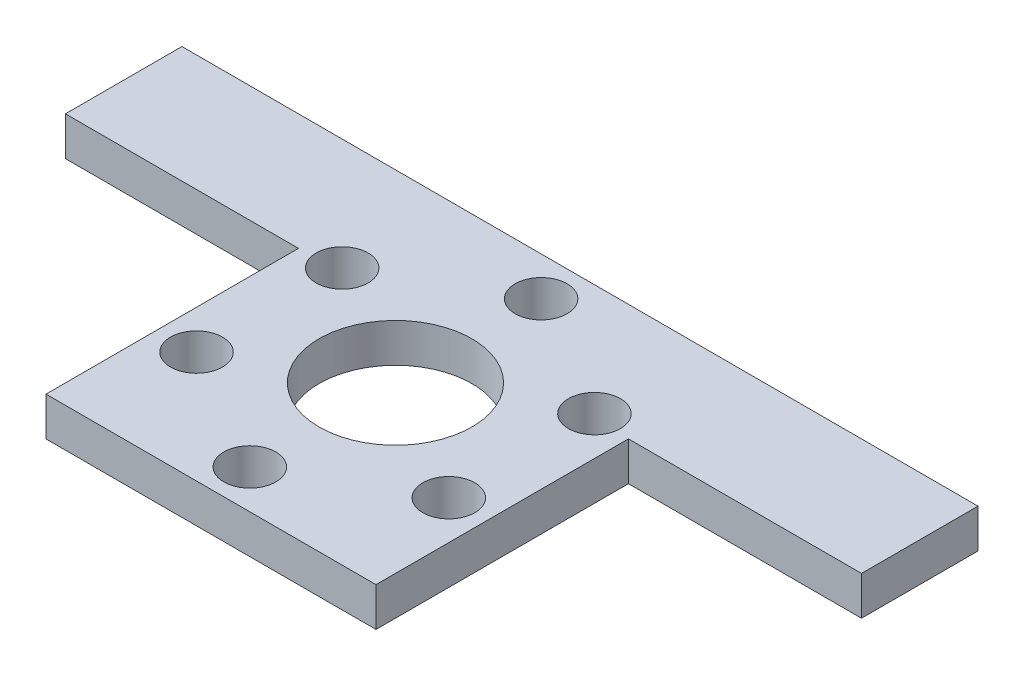
ISO-10303-21;
HEADER;
FILE_DESCRIPTION(('STEP AP214'),'2;1');
FILE_NAME('part.step','',(''),(''),'','','');
FILE_SCHEMA(('AUTOMOTIVE_DESIGN { 1 0 10303 214 1 1 1 1 }'));
ENDSEC;
DATA;
#1=APPLICATION_CONTEXT('core data for automotive mechanical design processes');
#2=APPLICATION_PROTOCOL_DEFINITION('international standard','automotive_design',2000,#1);
#3=PRODUCT_CONTEXT('',#1,'mechanical');
#4=PRODUCT('Part','Part','',(#3));
#5=PRODUCT_RELATED_PRODUCT_CATEGORY('part','',(#4));
#6=PRODUCT_DEFINITION_FORMATION('','',#4);
#7=PRODUCT_DEFINITION_CONTEXT('part definition',#1,'design');
#8=PRODUCT_DEFINITION('design','',#6,#7);
#9=PRODUCT_DEFINITION_SHAPE('','',#8);
#10=(LENGTH_UNIT() NAMED_UNIT(*) SI_UNIT(.MILLI.,.METRE.));
#11=(NAMED_UNIT(*) PLANE_ANGLE_UNIT() SI_UNIT($,.RADIAN.));
#12=(NAMED_UNIT(*) SI_UNIT($,.STERADIAN.) SOLID_ANGLE_UNIT());
#13=UNCERTAINTY_MEASURE_WITH_UNIT(LENGTH_MEASURE(1.E-05),#10,'distance_accuracy_value','');
#14=(GEOMETRIC_REPRESENTATION_CONTEXT(3) GLOBAL_UNCERTAINTY_ASSIGNED_CONTEXT((#13)) GLOBAL_UNIT_ASSIGNED_CONTEXT((#10,
#11,#12)) REPRESENTATION_CONTEXT('',''));
#15=CARTESIAN_POINT('',(0.,0.,0.));
#16=DIRECTION('',(0.,0.,1.));
#17=DIRECTION('',(1.,0.,0.));
#18=AXIS2_PLACEMENT_3D('',#15,#16,#17);
#19=CARTESIAN_POINT('',(0.,2.54,0.));
#20=DIRECTION('',(0.,-1.,0.));
#21=DIRECTION('',(0.,0.,-1.));
#22=AXIS2_PLACEMENT_3D('',#19,#20,#21);
#23=PLANE('',#22);
#24=CARTESIAN_POINT('',(0.,2.54,-9.525));
#25=DIRECTION('',(0.,1.,0.));
#26=DIRECTION('',(0.,0.,1.));
#27=AXIS2_PLACEMENT_3D('',#24,#25,#26);
#28=CIRCLE('',#27,1.7);
#29=CARTESIAN_POINT('',(0.,2.54,-7.825));
#30=VERTEX_POINT('',#29);
#31=EDGE_CURVE('E260',#30,#30,#28,.T.);
#32=ORIENTED_EDGE('',*,*,#31,.F.);
#33=EDGE_LOOP('',(#32));
#34=FACE_BOUND('',#33,.T.);
#35=CARTESIAN_POINT('',(8.24889197104678,2.54,-4.7625));
#36=DIRECTION('',(0.,1.,0.));
#37=DIRECTION('',(0.,0.,1.));
#38=AXIS2_PLACEMENT_3D('',#35,#36,#37);
#39=CIRCLE('',#38,1.7);
#40=CARTESIAN_POINT('',(8.24889197104678,2.54,-3.0625));
#41=VERTEX_POINT('',#40);
#42=EDGE_CURVE('E252',#41,#41,#39,.T.);
#43=ORIENTED_EDGE('',*,*,#42,.F.);
#44=EDGE_LOOP('',(#43));
#45=FACE_BOUND('',#44,.T.);
#46=CARTESIAN_POINT('',(8.24889197104678,2.54,4.7625));
#47=DIRECTION('',(0.,1.,0.));
#48=DIRECTION('',(0.,0.,1.));
#49=AXIS2_PLACEMENT_3D('',#46,#47,#48);
#50=CIRCLE('',#49,1.7);
#51=CARTESIAN_POINT('',(8.24889197104678,2.54,6.4625));
#52=VERTEX_POINT('',#51);
#53=EDGE_CURVE('E244',#52,#52,#50,.T.);
#54=ORIENTED_EDGE('',*,*,#53,.F.);
#55=EDGE_LOOP('',(#54));
#56=FACE_BOUND('',#55,.T.);
#57=CARTESIAN_POINT('',(0.,2.54,9.525));
#58=DIRECTION('',(0.,1.,0.));
#59=DIRECTION('',(0.,0.,1.));
#60=AXIS2_PLACEMENT_3D('',#57,#58,#59);
#61=CIRCLE('',#60,1.7);
#62=CARTESIAN_POINT('',(0.,2.54,11.225));
#63=VERTEX_POINT('',#62);
#64=EDGE_CURVE('E236',#63,#63,#61,.T.);
#65=ORIENTED_EDGE('',*,*,#64,.F.);
#66=EDGE_LOOP('',(#65));
#67=FACE_BOUND('',#66,.T.);
#68=CARTESIAN_POINT('',(-8.24889197104678,2.54,4.7625));
#69=DIRECTION('',(0.,1.,0.));
#70=DIRECTION('',(0.,0.,1.));
#71=AXIS2_PLACEMENT_3D('',#68,#69,#70);
#72=CIRCLE('',#71,1.7);
#73=CARTESIAN_POINT('',(-8.24889197104678,2.54,6.4625));
#74=VERTEX_POINT('',#73);
#75=EDGE_CURVE('E228',#74,#74,#72,.T.);
#76=ORIENTED_EDGE('',*,*,#75,.F.);
#77=EDGE_LOOP('',(#76));
#78=FACE_BOUND('',#77,.T.);
#79=CARTESIAN_POINT('',(-8.24889197104678,2.54,-4.7625));
#80=DIRECTION('',(0.,1.,0.));
#81=DIRECTION('',(0.,0.,1.));
#82=AXIS2_PLACEMENT_3D('',#79,#80,#81);
#83=CIRCLE('',#82,1.7);
#84=CARTESIAN_POINT('',(-8.24889197104678,2.54,-3.0625));
#85=VERTEX_POINT('',#84);
#86=EDGE_CURVE('E220',#85,#85,#83,.T.);
#87=ORIENTED_EDGE('',*,*,#86,.F.);
#88=EDGE_LOOP('',(#87));
#89=FACE_BOUND('',#88,.T.);
#90=DIRECTION('',(1.,0.,0.));
#91=VECTOR('',#90,1.);
#92=CARTESIAN_POINT('',(-26.0288919710468,2.54,-4.445));
#93=LINE('',#92,#91);
#94=CARTESIAN_POINT('',(-26.0288919710468,2.54,-4.445));
#95=VERTEX_POINT('',#94);
#96=CARTESIAN_POINT('',(-10.7888919710468,2.54,-4.445));
#97=VERTEX_POINT('',#96);
#98=EDGE_CURVE('E164',#95,#97,#93,.T.);
#99=ORIENTED_EDGE('',*,*,#98,.T.);
#100=DIRECTION('',(0.,0.,1.));
#101=VECTOR('',#100,1.);
#102=CARTESIAN_POINT('',(-10.7888919710468,2.54,-4.445));
#103=LINE('',#102,#101);
#104=CARTESIAN_POINT('',(-10.7888919710468,2.54,12.065));
#105=VERTEX_POINT('',#104);
#106=EDGE_CURVE('E100',#97,#105,#103,.T.);
#107=ORIENTED_EDGE('',*,*,#106,.T.);
#108=DIRECTION('',(1.,0.,0.));
#109=VECTOR('',#108,1.);
#110=CARTESIAN_POINT('',(-10.7888919710468,2.54,12.065));
#111=LINE('',#110,#109);
#112=CARTESIAN_POINT('',(10.7888919710468,2.54,12.065));
#113=VERTEX_POINT('',#112);
#114=EDGE_CURVE('E185',#105,#113,#111,.T.);
#115=ORIENTED_EDGE('',*,*,#114,.T.);
#116=DIRECTION('',(0.,0.,-1.));
#117=VECTOR('',#116,1.);
#118=CARTESIAN_POINT('',(10.7888919710468,2.54,-4.445));
#119=LINE('',#118,#117);
#120=CARTESIAN_POINT('',(10.7888919710468,2.54,-4.445));
#121=VERTEX_POINT('',#120);
#122=EDGE_CURVE('E199',#113,#121,#119,.T.);
#123=ORIENTED_EDGE('',*,*,#122,.T.);
#124=DIRECTION('',(1.,0.,0.));
#125=VECTOR('',#124,1.);
#126=CARTESIAN_POINT('',(10.7888919710468,2.54,-4.445));
#127=LINE('',#126,#125);
#128=CARTESIAN_POINT('',(26.0288919710468,2.54,-4.445));
#129=VERTEX_POINT('',#128);
#130=EDGE_CURVE('E119',#121,#129,#127,.T.);
#131=ORIENTED_EDGE('',*,*,#130,.T.);
#132=DIRECTION('',(0.,0.,-1.));
#133=VECTOR('',#132,1.);
#134=CARTESIAN_POINT('',(26.0288919710468,2.54,-12.065));
#135=LINE('',#134,#133);
#136=CARTESIAN_POINT('',(26.0288919710468,2.54,-12.065));
#137=VERTEX_POINT('',#136);
#138=EDGE_CURVE('E113',#129,#137,#135,.T.);
#139=ORIENTED_EDGE('',*,*,#138,.T.);
#140=DIRECTION('',(-1.,0.,0.));
#141=VECTOR('',#140,1.);
#142=CARTESIAN_POINT('',(-26.0288919710468,2.54,-12.065));
#143=LINE('',#142,#141);
#144=CARTESIAN_POINT('',(-26.0288919710468,2.54,-12.065));
#145=VERTEX_POINT('',#144);
#146=EDGE_CURVE('E117',#137,#145,#143,.T.);
#147=ORIENTED_EDGE('',*,*,#146,.T.);
#148=DIRECTION('',(0.,0.,1.));
#149=VECTOR('',#148,1.);
#150=CARTESIAN_POINT('',(-26.0288919710468,2.54,-12.065));
#151=LINE('',#150,#149);
#152=EDGE_CURVE('E57',#145,#95,#151,.T.);
#153=ORIENTED_EDGE('',*,*,#152,.T.);
#154=EDGE_LOOP('',(#99,#107,#115,#123,#131,#139,#147,#153));
#155=FACE_BOUND('',#154,.T.);
#156=CARTESIAN_POINT('',(0.,2.54,0.));
#157=DIRECTION('',(0.,1.,0.));
#158=DIRECTION('',(0.,0.,1.));
#159=AXIS2_PLACEMENT_3D('',#156,#157,#158);
#160=CIRCLE('',#159,5.);
#161=CARTESIAN_POINT('',(0.,2.54,5.));
#162=VERTEX_POINT('',#161);
#163=EDGE_CURVE('E146',#162,#162,#160,.T.);
#164=ORIENTED_EDGE('',*,*,#163,.F.);
#165=EDGE_LOOP('',(#164));
#166=FACE_BOUND('',#165,.T.);
#167=ADVANCED_FACE('F39',(#34,#45,#56,#67,#78,#89,#155,#166),#23,.F.);
#168=CARTESIAN_POINT('',(0.,0.,0.));
#169=DIRECTION('',(0.,-1.,0.));
#170=DIRECTION('',(0.,0.,-1.));
#171=AXIS2_PLACEMENT_3D('',#168,#169,#170);
#172=PLANE('',#171);
#173=CARTESIAN_POINT('',(0.,0.,-9.525));
#174=DIRECTION('',(0.,1.,0.));
#175=DIRECTION('',(0.,0.,1.));
#176=AXIS2_PLACEMENT_3D('',#173,#174,#175);
#177=CIRCLE('',#176,1.7);
#178=CARTESIAN_POINT('',(0.,0.,-7.825));
#179=VERTEX_POINT('',#178);
#180=EDGE_CURVE('E256',#179,#179,#177,.T.);
#181=ORIENTED_EDGE('',*,*,#180,.T.);
#182=EDGE_LOOP('',(#181));
#183=FACE_BOUND('',#182,.T.);
#184=CARTESIAN_POINT('',(8.24889197104678,0.,-4.7625));
#185=DIRECTION('',(0.,1.,0.));
#186=DIRECTION('',(0.,0.,1.));
#187=AXIS2_PLACEMENT_3D('',#184,#185,#186);
#188=CIRCLE('',#187,1.7);
#189=CARTESIAN_POINT('',(8.24889197104678,0.,-3.06250000000001));
#190=VERTEX_POINT('',#189);
#191=EDGE_CURVE('E248',#190,#190,#188,.T.);
#192=ORIENTED_EDGE('',*,*,#191,.T.);
#193=EDGE_LOOP('',(#192));
#194=FACE_BOUND('',#193,.T.);
#195=CARTESIAN_POINT('',(8.24889197104678,0.,4.7625));
#196=DIRECTION('',(0.,1.,0.));
#197=DIRECTION('',(0.,0.,1.));
#198=AXIS2_PLACEMENT_3D('',#195,#196,#197);
#199=CIRCLE('',#198,1.7);
#200=CARTESIAN_POINT('',(8.24889197104678,0.,6.4625));
#201=VERTEX_POINT('',#200);
#202=EDGE_CURVE('E240',#201,#201,#199,.T.);
#203=ORIENTED_EDGE('',*,*,#202,.T.);
#204=EDGE_LOOP('',(#203));
#205=FACE_BOUND('',#204,.T.);
#206=CARTESIAN_POINT('',(0.,0.,9.525));
#207=DIRECTION('',(0.,1.,0.));
#208=DIRECTION('',(0.,0.,1.));
#209=AXIS2_PLACEMENT_3D('',#206,#207,#208);
#210=CIRCLE('',#209,1.7);
#211=CARTESIAN_POINT('',(0.,0.,11.225));
#212=VERTEX_POINT('',#211);
#213=EDGE_CURVE('E232',#212,#212,#210,.T.);
#214=ORIENTED_EDGE('',*,*,#213,.T.);
#215=EDGE_LOOP('',(#214));
#216=FACE_BOUND('',#215,.T.);
#217=CARTESIAN_POINT('',(-8.24889197104678,0.,4.7625));
#218=DIRECTION('',(0.,1.,0.));
#219=DIRECTION('',(0.,0.,1.));
#220=AXIS2_PLACEMENT_3D('',#217,#218,#219);
#221=CIRCLE('',#220,1.7);
#222=CARTESIAN_POINT('',(-8.24889197104678,0.,6.4625));
#223=VERTEX_POINT('',#222);
#224=EDGE_CURVE('E224',#223,#223,#221,.T.);
#225=ORIENTED_EDGE('',*,*,#224,.T.);
#226=EDGE_LOOP('',(#225));
#227=FACE_BOUND('',#226,.T.);
#228=CARTESIAN_POINT('',(-8.24889197104678,0.,-4.7625));
#229=DIRECTION('',(0.,1.,0.));
#230=DIRECTION('',(0.,0.,1.));
#231=AXIS2_PLACEMENT_3D('',#228,#229,#230);
#232=CIRCLE('',#231,1.7);
#233=CARTESIAN_POINT('',(-8.24889197104678,0.,-3.0625));
#234=VERTEX_POINT('',#233);
#235=EDGE_CURVE('E213',#234,#234,#232,.T.);
#236=ORIENTED_EDGE('',*,*,#235,.T.);
#237=EDGE_LOOP('',(#236));
#238=FACE_BOUND('',#237,.T.);
#239=DIRECTION('',(1.,0.,0.));
#240=VECTOR('',#239,1.);
#241=CARTESIAN_POINT('',(-26.0288919710468,0.,-4.445));
#242=LINE('',#241,#240);
#243=CARTESIAN_POINT('',(-26.0288919710468,0.,-4.445));
#244=VERTEX_POINT('',#243);
#245=CARTESIAN_POINT('',(-10.7888919710468,0.,-4.445));
#246=VERTEX_POINT('',#245);
#247=EDGE_CURVE('E141',#244,#246,#242,.T.);
#248=ORIENTED_EDGE('',*,*,#247,.F.);
#249=DIRECTION('',(0.,0.,1.));
#250=VECTOR('',#249,1.);
#251=CARTESIAN_POINT('',(-26.0288919710468,0.,-12.065));
#252=LINE('',#251,#250);
#253=CARTESIAN_POINT('',(-26.0288919710468,0.,-12.065));
#254=VERTEX_POINT('',#253);
#255=EDGE_CURVE('E92',#254,#244,#252,.T.);
#256=ORIENTED_EDGE('',*,*,#255,.F.);
#257=DIRECTION('',(-1.,0.,0.));
#258=VECTOR('',#257,1.);
#259=CARTESIAN_POINT('',(-26.0288919710468,0.,-12.065));
#260=LINE('',#259,#258);
#261=CARTESIAN_POINT('',(26.0288919710468,0.,-12.065));
#262=VERTEX_POINT('',#261);
#263=EDGE_CURVE('E86',#262,#254,#260,.T.);
#264=ORIENTED_EDGE('',*,*,#263,.F.);
#265=DIRECTION('',(0.,0.,-1.));
#266=VECTOR('',#265,1.);
#267=CARTESIAN_POINT('',(26.0288919710468,0.,-12.065));
#268=LINE('',#267,#266);
#269=CARTESIAN_POINT('',(26.0288919710468,0.,-4.445));
#270=VERTEX_POINT('',#269);
#271=EDGE_CURVE('E128',#270,#262,#268,.T.);
#272=ORIENTED_EDGE('',*,*,#271,.F.);
#273=DIRECTION('',(1.,0.,0.));
#274=VECTOR('',#273,1.);
#275=CARTESIAN_POINT('',(10.7888919710468,0.,-4.445));
#276=LINE('',#275,#274);
#277=CARTESIAN_POINT('',(10.7888919710468,0.,-4.445));
#278=VERTEX_POINT('',#277);
#279=EDGE_CURVE('E155',#278,#270,#276,.T.);
#280=ORIENTED_EDGE('',*,*,#279,.F.);
#281=DIRECTION('',(0.,0.,-1.));
#282=VECTOR('',#281,1.);
#283=CARTESIAN_POINT('',(10.7888919710468,0.,-4.445));
#284=LINE('',#283,#282);
#285=CARTESIAN_POINT('',(10.7888919710468,0.,12.065));
#286=VERTEX_POINT('',#285);
#287=EDGE_CURVE('E152',#286,#278,#284,.T.);
#288=ORIENTED_EDGE('',*,*,#287,.F.);
#289=DIRECTION('',(1.,0.,0.));
#290=VECTOR('',#289,1.);
#291=CARTESIAN_POINT('',(-10.7888919710468,0.,12.065));
#292=LINE('',#291,#290);
#293=CARTESIAN_POINT('',(-10.7888919710468,0.,12.065));
#294=VERTEX_POINT('',#293);
#295=EDGE_CURVE('E149',#294,#286,#292,.T.);
#296=ORIENTED_EDGE('',*,*,#295,.F.);
#297=DIRECTION('',(0.,0.,1.));
#298=VECTOR('',#297,1.);
#299=CARTESIAN_POINT('',(-10.7888919710468,0.,-4.445));
#300=LINE('',#299,#298);
#301=EDGE_CURVE('E145',#246,#294,#300,.T.);
#302=ORIENTED_EDGE('',*,*,#301,.F.);
#303=EDGE_LOOP('',(#248,#256,#264,#272,#280,#288,#296,#302));
#304=FACE_BOUND('',#303,.T.);
#305=CARTESIAN_POINT('',(0.,0.,0.));
#306=DIRECTION('',(0.,1.,0.));
#307=DIRECTION('',(0.,0.,1.));
#308=AXIS2_PLACEMENT_3D('',#305,#306,#307);
#309=CIRCLE('',#308,5.);
#310=CARTESIAN_POINT('',(0.,0.,5.));
#311=VERTEX_POINT('',#310);
#312=EDGE_CURVE('E209',#311,#311,#309,.T.);
#313=ORIENTED_EDGE('',*,*,#312,.T.);
#314=EDGE_LOOP('',(#313));
#315=FACE_BOUND('',#314,.T.);
#316=ADVANCED_FACE('F189',(#183,#194,#205,#216,#227,#238,#304,#315),#172,.T.);
#317=CARTESIAN_POINT('',(-26.0288919710468,2.54,-4.445));
#318=DIRECTION('',(0.,0.,-1.));
#319=DIRECTION('',(-1.,0.,0.));
#320=AXIS2_PLACEMENT_3D('',#317,#318,#319);
#321=PLANE('',#320);
#322=ORIENTED_EDGE('',*,*,#247,.T.);
#323=DIRECTION('',(0.,-1.,0.));
#324=VECTOR('',#323,1.);
#325=CARTESIAN_POINT('',(-10.7888919710468,2.54,-4.445));
#326=LINE('',#325,#324);
#327=EDGE_CURVE('E11',#97,#246,#326,.T.);
#328=ORIENTED_EDGE('',*,*,#327,.F.);
#329=ORIENTED_EDGE('',*,*,#98,.F.);
#330=DIRECTION('',(0.,-1.,0.));
#331=VECTOR('',#330,1.);
#332=CARTESIAN_POINT('',(-26.0288919710468,2.54,-4.445));
#333=LINE('',#332,#331);
#334=EDGE_CURVE('E137',#95,#244,#333,.T.);
#335=ORIENTED_EDGE('',*,*,#334,.T.);
#336=EDGE_LOOP('',(#322,#328,#329,#335));
#337=FACE_BOUND('',#336,.T.);
#338=ADVANCED_FACE('F41',(#337),#321,.F.);
#339=CARTESIAN_POINT('',(-10.7888919710468,2.54,-4.445));
#340=DIRECTION('',(1.,0.,0.));
#341=DIRECTION('',(0.,0.,-1.));
#342=AXIS2_PLACEMENT_3D('',#339,#340,#341);
#343=PLANE('',#342);
#344=ORIENTED_EDGE('',*,*,#301,.T.);
#345=DIRECTION('',(0.,-1.,0.));
#346=VECTOR('',#345,1.);
#347=CARTESIAN_POINT('',(-10.7888919710468,2.54,12.065));
#348=LINE('',#347,#346);
#349=EDGE_CURVE('E49',#105,#294,#348,.T.);
#350=ORIENTED_EDGE('',*,*,#349,.F.);
#351=ORIENTED_EDGE('',*,*,#106,.F.);
#352=ORIENTED_EDGE('',*,*,#327,.T.);
#353=EDGE_LOOP('',(#344,#350,#351,#352));
#354=FACE_BOUND('',#353,.T.);
#355=ADVANCED_FACE('F313',(#354),#343,.F.);
#356=CARTESIAN_POINT('',(-10.7888919710468,2.54,12.065));
#357=DIRECTION('',(0.,0.,-1.));
#358=DIRECTION('',(-1.,0.,0.));
#359=AXIS2_PLACEMENT_3D('',#356,#357,#358);
#360=PLANE('',#359);
#361=ORIENTED_EDGE('',*,*,#295,.T.);
#362=DIRECTION('',(0.,-1.,0.));
#363=VECTOR('',#362,1.);
#364=CARTESIAN_POINT('',(10.7888919710468,2.54,12.065));
#365=LINE('',#364,#363);
#366=EDGE_CURVE('E175',#113,#286,#365,.T.);
#367=ORIENTED_EDGE('',*,*,#366,.F.);
#368=ORIENTED_EDGE('',*,*,#114,.F.);
#369=ORIENTED_EDGE('',*,*,#349,.T.);
#370=EDGE_LOOP('',(#361,#367,#368,#369));
#371=FACE_BOUND('',#370,.T.);
#372=ADVANCED_FACE('F183',(#371),#360,.F.);
#373=CARTESIAN_POINT('',(10.7888919710468,2.54,-4.445));
#374=DIRECTION('',(-1.,0.,0.));
#375=DIRECTION('',(0.,0.,1.));
#376=AXIS2_PLACEMENT_3D('',#373,#374,#375);
#377=PLANE('',#376);
#378=ORIENTED_EDGE('',*,*,#287,.T.);
#379=DIRECTION('',(0.,-1.,0.));
#380=VECTOR('',#379,1.);
#381=CARTESIAN_POINT('',(10.7888919710468,2.54,-4.445));
#382=LINE('',#381,#380);
#383=EDGE_CURVE('E171',#121,#278,#382,.T.);
#384=ORIENTED_EDGE('',*,*,#383,.F.);
#385=ORIENTED_EDGE('',*,*,#122,.F.);
#386=ORIENTED_EDGE('',*,*,#366,.T.);
#387=EDGE_LOOP('',(#378,#384,#385,#386));
#388=FACE_BOUND('',#387,.T.);
#389=ADVANCED_FACE('F194',(#388),#377,.F.);
#390=CARTESIAN_POINT('',(10.7888919710468,2.54,-4.445));
#391=DIRECTION('',(0.,0.,-1.));
#392=DIRECTION('',(-1.,0.,0.));
#393=AXIS2_PLACEMENT_3D('',#390,#391,#392);
#394=PLANE('',#393);
#395=ORIENTED_EDGE('',*,*,#279,.T.);
#396=DIRECTION('',(0.,-1.,0.));
#397=VECTOR('',#396,1.);
#398=CARTESIAN_POINT('',(26.0288919710468,2.54,-4.445));
#399=LINE('',#398,#397);
#400=EDGE_CURVE('E130',#129,#270,#399,.T.);
#401=ORIENTED_EDGE('',*,*,#400,.F.);
#402=ORIENTED_EDGE('',*,*,#130,.F.);
#403=ORIENTED_EDGE('',*,*,#383,.T.);
#404=EDGE_LOOP('',(#395,#401,#402,#403));
#405=FACE_BOUND('',#404,.T.);
#406=ADVANCED_FACE('F197',(#405),#394,.F.);
#407=CARTESIAN_POINT('',(26.0288919710468,2.54,-12.065));
#408=DIRECTION('',(-1.,0.,0.));
#409=DIRECTION('',(0.,0.,1.));
#410=AXIS2_PLACEMENT_3D('',#407,#408,#409);
#411=PLANE('',#410);
#412=ORIENTED_EDGE('',*,*,#271,.T.);
#413=DIRECTION('',(0.,-1.,0.));
#414=VECTOR('',#413,1.);
#415=CARTESIAN_POINT('',(26.0288919710468,2.54,-12.065));
#416=LINE('',#415,#414);
#417=EDGE_CURVE('E125',#137,#262,#416,.T.);
#418=ORIENTED_EDGE('',*,*,#417,.F.);
#419=ORIENTED_EDGE('',*,*,#138,.F.);
#420=ORIENTED_EDGE('',*,*,#400,.T.);
#421=EDGE_LOOP('',(#412,#418,#419,#420));
#422=FACE_BOUND('',#421,.T.);
#423=ADVANCED_FACE('F126',(#422),#411,.F.);
#424=CARTESIAN_POINT('',(-26.0288919710468,2.54,-12.065));
#425=DIRECTION('',(0.,0.,1.));
#426=DIRECTION('',(1.,0.,0.));
#427=AXIS2_PLACEMENT_3D('',#424,#425,#426);
#428=PLANE('',#427);
#429=ORIENTED_EDGE('',*,*,#263,.T.);
#430=DIRECTION('',(0.,-1.,0.));
#431=VECTOR('',#430,1.);
#432=CARTESIAN_POINT('',(-26.0288919710468,2.54,-12.065));
#433=LINE('',#432,#431);
#434=EDGE_CURVE('E131',#145,#254,#433,.T.);
#435=ORIENTED_EDGE('',*,*,#434,.F.);
#436=ORIENTED_EDGE('',*,*,#146,.F.);
#437=ORIENTED_EDGE('',*,*,#417,.T.);
#438=EDGE_LOOP('',(#429,#435,#436,#437));
#439=FACE_BOUND('',#438,.T.);
#440=ADVANCED_FACE('F133',(#439),#428,.F.);
#441=CARTESIAN_POINT('',(-26.0288919710468,2.54,-12.065));
#442=DIRECTION('',(1.,0.,0.));
#443=DIRECTION('',(0.,0.,-1.));
#444=AXIS2_PLACEMENT_3D('',#441,#442,#443);
#445=PLANE('',#444);
#446=ORIENTED_EDGE('',*,*,#255,.T.);
#447=ORIENTED_EDGE('',*,*,#334,.F.);
#448=ORIENTED_EDGE('',*,*,#152,.F.);
#449=ORIENTED_EDGE('',*,*,#434,.T.);
#450=EDGE_LOOP('',(#446,#447,#448,#449));
#451=FACE_BOUND('',#450,.T.);
#452=ADVANCED_FACE('F293',(#451),#445,.F.);
#453=CARTESIAN_POINT('',(0.,2.54,0.));
#454=DIRECTION('',(0.,-1.,0.));
#455=DIRECTION('',(0.,0.,-1.));
#456=AXIS2_PLACEMENT_3D('',#453,#454,#455);
#457=CYLINDRICAL_SURFACE('',#456,5.);
#458=ORIENTED_EDGE('',*,*,#163,.T.);
#459=EDGE_LOOP('',(#458));
#460=FACE_BOUND('',#459,.T.);
#461=ORIENTED_EDGE('',*,*,#312,.F.);
#462=EDGE_LOOP('',(#461));
#463=FACE_BOUND('',#462,.T.);
#464=ADVANCED_FACE('F283',(#460,#463),#457,.F.);
#465=CARTESIAN_POINT('',(-8.24889197104678,2.54,-4.7625));
#466=DIRECTION('',(0.,1.,0.));
#467=DIRECTION('',(0.,0.,1.));
#468=AXIS2_PLACEMENT_3D('',#465,#466,#467);
#469=CYLINDRICAL_SURFACE('',#468,1.7);
#470=ORIENTED_EDGE('',*,*,#235,.F.);
#471=EDGE_LOOP('',(#470));
#472=FACE_BOUND('',#471,.T.);
#473=ORIENTED_EDGE('',*,*,#86,.T.);
#474=EDGE_LOOP('',(#473));
#475=FACE_BOUND('',#474,.T.);
#476=ADVANCED_FACE('F280',(#472,#475),#469,.F.);
#477=CARTESIAN_POINT('',(-8.24889197104678,2.54,4.7625));
#478=DIRECTION('',(0.,1.,0.));
#479=DIRECTION('',(0.,0.,1.));
#480=AXIS2_PLACEMENT_3D('',#477,#478,#479);
#481=CYLINDRICAL_SURFACE('',#480,1.7);
#482=ORIENTED_EDGE('',*,*,#224,.F.);
#483=EDGE_LOOP('',(#482));
#484=FACE_BOUND('',#483,.T.);
#485=ORIENTED_EDGE('',*,*,#75,.T.);
#486=EDGE_LOOP('',(#485));
#487=FACE_BOUND('',#486,.T.);
#488=ADVANCED_FACE('F282',(#484,#487),#481,.F.);
#489=CARTESIAN_POINT('',(0.,2.54,9.525));
#490=DIRECTION('',(0.,1.,0.));
#491=DIRECTION('',(0.,0.,1.));
#492=AXIS2_PLACEMENT_3D('',#489,#490,#491);
#493=CYLINDRICAL_SURFACE('',#492,1.7);
#494=ORIENTED_EDGE('',*,*,#213,.F.);
#495=EDGE_LOOP('',(#494));
#496=FACE_BOUND('',#495,.T.);
#497=ORIENTED_EDGE('',*,*,#64,.T.);
#498=EDGE_LOOP('',(#497));
#499=FACE_BOUND('',#498,.T.);
#500=ADVANCED_FACE('F290',(#496,#499),#493,.F.);
#501=CARTESIAN_POINT('',(8.24889197104678,2.54,4.7625));
#502=DIRECTION('',(0.,1.,0.));
#503=DIRECTION('',(0.,0.,1.));
#504=AXIS2_PLACEMENT_3D('',#501,#502,#503);
#505=CYLINDRICAL_SURFACE('',#504,1.7);
#506=ORIENTED_EDGE('',*,*,#202,.F.);
#507=EDGE_LOOP('',(#506));
#508=FACE_BOUND('',#507,.T.);
#509=ORIENTED_EDGE('',*,*,#53,.T.);
#510=EDGE_LOOP('',(#509));
#511=FACE_BOUND('',#510,.T.);
#512=ADVANCED_FACE('F400',(#508,#511),#505,.F.);
#513=CARTESIAN_POINT('',(8.24889197104678,2.54,-4.7625));
#514=DIRECTION('',(0.,1.,0.));
#515=DIRECTION('',(0.,0.,1.));
#516=AXIS2_PLACEMENT_3D('',#513,#514,#515);
#517=CYLINDRICAL_SURFACE('',#516,1.7);
#518=ORIENTED_EDGE('',*,*,#191,.F.);
#519=EDGE_LOOP('',(#518));
#520=FACE_BOUND('',#519,.T.);
#521=ORIENTED_EDGE('',*,*,#42,.T.);
#522=EDGE_LOOP('',(#521));
#523=FACE_BOUND('',#522,.T.);
#524=ADVANCED_FACE('F408',(#520,#523),#517,.F.);
#525=CARTESIAN_POINT('',(0.,2.54,-9.525));
#526=DIRECTION('',(0.,1.,0.));
#527=DIRECTION('',(0.,0.,1.));
#528=AXIS2_PLACEMENT_3D('',#525,#526,#527);
#529=CYLINDRICAL_SURFACE('',#528,1.7);
#530=ORIENTED_EDGE('',*,*,#180,.F.);
#531=EDGE_LOOP('',(#530));
#532=FACE_BOUND('',#531,.T.);
#533=ORIENTED_EDGE('',*,*,#31,.T.);
#534=EDGE_LOOP('',(#533));
#535=FACE_BOUND('',#534,.T.);
#536=ADVANCED_FACE('F265',(#532,#535),#529,.F.);
#537=CLOSED_SHELL('',(#167,#316,#338,#355,#372,#389,#406,#423,#440,#452,#464,#476,#488,#500,
#512,#524,#536));
#538=MANIFOLD_SOLID_BREP('B2',#537);
#539=ADVANCED_BREP_SHAPE_REPRESENTATION('',(#18,#538),#14);
#540=SHAPE_DEFINITION_REPRESENTATION(#9,#539);
ENDSEC;
END-ISO-10303-21;
